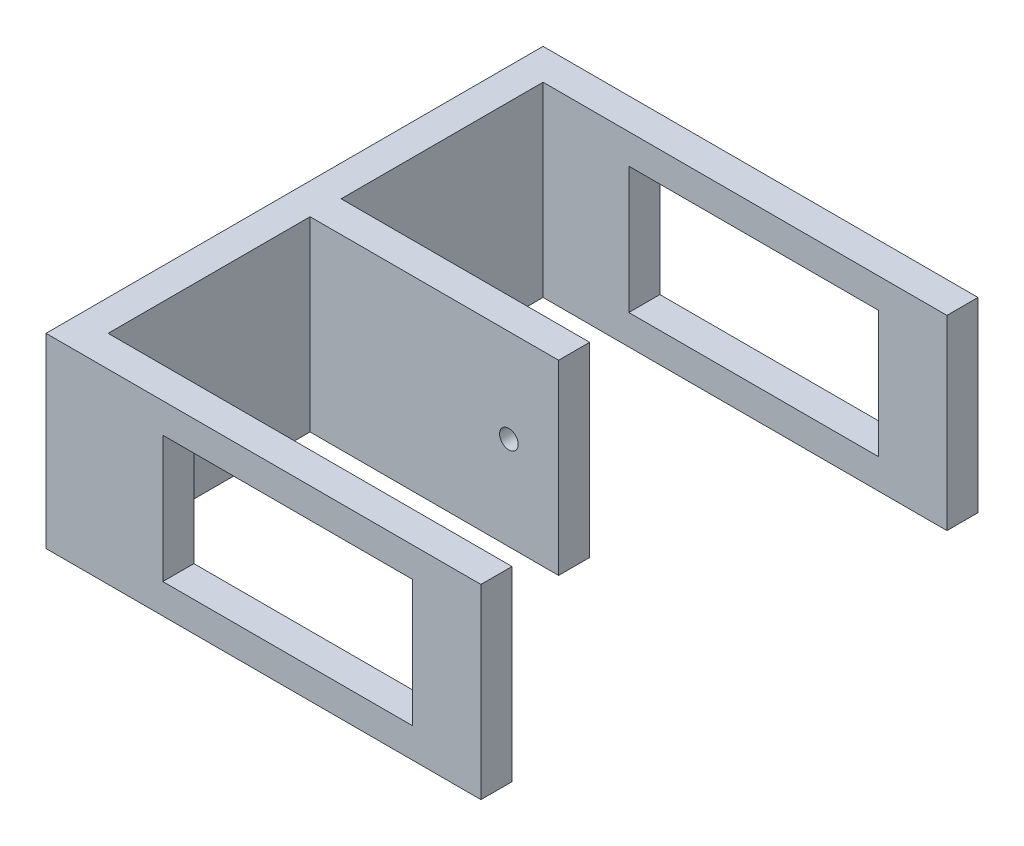
ISO-10303-21;
HEADER;
FILE_DESCRIPTION(('STEP AP214'),'2;1');
FILE_NAME('part.step','',(''),(''),'','','');
FILE_SCHEMA(('AUTOMOTIVE_DESIGN { 1 0 10303 214 1 1 1 1 }'));
ENDSEC;
DATA;
#1=APPLICATION_CONTEXT('core data for automotive mechanical design processes');
#2=APPLICATION_PROTOCOL_DEFINITION('international standard','automotive_design',2000,#1);
#3=PRODUCT_CONTEXT('',#1,'mechanical');
#4=PRODUCT('Part','Part','',(#3));
#5=PRODUCT_RELATED_PRODUCT_CATEGORY('part','',(#4));
#6=PRODUCT_DEFINITION_FORMATION('','',#4);
#7=PRODUCT_DEFINITION_CONTEXT('part definition',#1,'design');
#8=PRODUCT_DEFINITION('design','',#6,#7);
#9=PRODUCT_DEFINITION_SHAPE('','',#8);
#10=(LENGTH_UNIT() NAMED_UNIT(*) SI_UNIT(.MILLI.,.METRE.));
#11=(NAMED_UNIT(*) PLANE_ANGLE_UNIT() SI_UNIT($,.RADIAN.));
#12=(NAMED_UNIT(*) SI_UNIT($,.STERADIAN.) SOLID_ANGLE_UNIT());
#13=UNCERTAINTY_MEASURE_WITH_UNIT(LENGTH_MEASURE(1.E-05),#10,'distance_accuracy_value','');
#14=(GEOMETRIC_REPRESENTATION_CONTEXT(3) GLOBAL_UNCERTAINTY_ASSIGNED_CONTEXT((#13)) GLOBAL_UNIT_ASSIGNED_CONTEXT((#10,
#11,#12)) REPRESENTATION_CONTEXT('',''));
#15=CARTESIAN_POINT('',(0.,0.,0.));
#16=DIRECTION('',(0.,0.,1.));
#17=DIRECTION('',(1.,0.,0.));
#18=AXIS2_PLACEMENT_3D('',#15,#16,#17);
#19=CARTESIAN_POINT('',(5.,30.,80.));
#20=DIRECTION('',(-1.,0.,0.));
#21=DIRECTION('',(0.,-1.,0.));
#22=AXIS2_PLACEMENT_3D('',#19,#20,#21);
#23=PLANE('',#22);
#24=DIRECTION('',(0.,1.,0.));
#25=VECTOR('',#24,1.);
#26=CARTESIAN_POINT('',(5.,0.,37.5));
#27=LINE('',#26,#25);
#28=CARTESIAN_POINT('',(5.,0.,37.5));
#29=VERTEX_POINT('',#28);
#30=CARTESIAN_POINT('',(5.,30.,37.5));
#31=VERTEX_POINT('',#30);
#32=EDGE_CURVE('E230',#29,#31,#27,.T.);
#33=ORIENTED_EDGE('',*,*,#32,.F.);
#34=DIRECTION('',(0.,0.,-1.));
#35=VECTOR('',#34,1.);
#36=CARTESIAN_POINT('',(5.,0.,80.));
#37=LINE('',#36,#35);
#38=CARTESIAN_POINT('',(5.,0.,5.));
#39=VERTEX_POINT('',#38);
#40=EDGE_CURVE('E293',#29,#39,#37,.T.);
#41=ORIENTED_EDGE('',*,*,#40,.T.);
#42=DIRECTION('',(0.,1.,0.));
#43=VECTOR('',#42,1.);
#44=CARTESIAN_POINT('',(5.,30.,5.));
#45=LINE('',#44,#43);
#46=CARTESIAN_POINT('',(5.,30.,5.));
#47=VERTEX_POINT('',#46);
#48=EDGE_CURVE('E278',#39,#47,#45,.T.);
#49=ORIENTED_EDGE('',*,*,#48,.T.);
#50=DIRECTION('',(0.,0.,-1.));
#51=VECTOR('',#50,1.);
#52=CARTESIAN_POINT('',(5.,30.,80.));
#53=LINE('',#52,#51);
#54=EDGE_CURVE('E287',#31,#47,#53,.T.);
#55=ORIENTED_EDGE('',*,*,#54,.F.);
#56=EDGE_LOOP('',(#33,#41,#49,#55));
#57=FACE_BOUND('',#56,.T.);
#58=ADVANCED_FACE('F45',(#57),#23,.F.);
#59=DIRECTION('',(0.,-1.,0.));
#60=VECTOR('',#59,1.);
#61=CARTESIAN_POINT('',(5.,0.,42.5));
#62=LINE('',#61,#60);
#63=CARTESIAN_POINT('',(5.,30.,42.5));
#64=VERTEX_POINT('',#63);
#65=CARTESIAN_POINT('',(5.,0.,42.5));
#66=VERTEX_POINT('',#65);
#67=EDGE_CURVE('E243',#64,#66,#62,.T.);
#68=ORIENTED_EDGE('',*,*,#67,.F.);
#69=CARTESIAN_POINT('',(5.,30.,75.));
#70=VERTEX_POINT('',#69);
#71=EDGE_CURVE('E290',#70,#64,#53,.T.);
#72=ORIENTED_EDGE('',*,*,#71,.F.);
#73=DIRECTION('',(0.,1.,0.));
#74=VECTOR('',#73,1.);
#75=CARTESIAN_POINT('',(5.,30.,75.));
#76=LINE('',#75,#74);
#77=CARTESIAN_POINT('',(5.,0.,75.));
#78=VERTEX_POINT('',#77);
#79=EDGE_CURVE('E261',#78,#70,#76,.T.);
#80=ORIENTED_EDGE('',*,*,#79,.F.);
#81=EDGE_CURVE('E294',#78,#66,#37,.T.);
#82=ORIENTED_EDGE('',*,*,#81,.T.);
#83=EDGE_LOOP('',(#68,#72,#80,#82));
#84=FACE_BOUND('',#83,.T.);
#85=ADVANCED_FACE('F352',(#84),#23,.F.);
#86=CARTESIAN_POINT('',(0.,0.,5.));
#87=DIRECTION('',(0.,0.,-1.));
#88=DIRECTION('',(-1.,0.,0.));
#89=AXIS2_PLACEMENT_3D('',#86,#87,#88);
#90=PLANE('',#89);
#91=DIRECTION('',(-1.,0.,0.));
#92=VECTOR('',#91,1.);
#93=CARTESIAN_POINT('',(18.8,25.2,5.));
#94=LINE('',#93,#92);
#95=CARTESIAN_POINT('',(59.,25.2,5.));
#96=VERTEX_POINT('',#95);
#97=CARTESIAN_POINT('',(18.8,25.2,5.));
#98=VERTEX_POINT('',#97);
#99=EDGE_CURVE('E225',#96,#98,#94,.T.);
#100=ORIENTED_EDGE('',*,*,#99,.F.);
#101=DIRECTION('',(0.,1.,0.));
#102=VECTOR('',#101,1.);
#103=CARTESIAN_POINT('',(59.,4.8,5.));
#104=LINE('',#103,#102);
#105=CARTESIAN_POINT('',(59.,4.8,5.));
#106=VERTEX_POINT('',#105);
#107=EDGE_CURVE('E210',#106,#96,#104,.T.);
#108=ORIENTED_EDGE('',*,*,#107,.F.);
#109=DIRECTION('',(1.,0.,0.));
#110=VECTOR('',#109,1.);
#111=CARTESIAN_POINT('',(18.8,4.8,5.));
#112=LINE('',#111,#110);
#113=CARTESIAN_POINT('',(18.8,4.8,5.));
#114=VERTEX_POINT('',#113);
#115=EDGE_CURVE('E207',#114,#106,#112,.T.);
#116=ORIENTED_EDGE('',*,*,#115,.F.);
#117=DIRECTION('',(0.,-1.,0.));
#118=VECTOR('',#117,1.);
#119=CARTESIAN_POINT('',(18.8,4.8,5.));
#120=LINE('',#119,#118);
#121=EDGE_CURVE('E228',#98,#114,#120,.T.);
#122=ORIENTED_EDGE('',*,*,#121,.F.);
#123=EDGE_LOOP('',(#100,#108,#116,#122));
#124=FACE_BOUND('',#123,.T.);
#125=ORIENTED_EDGE('',*,*,#48,.F.);
#126=DIRECTION('',(1.,0.,0.));
#127=VECTOR('',#126,1.);
#128=CARTESIAN_POINT('',(0.,0.,5.));
#129=LINE('',#128,#127);
#130=CARTESIAN_POINT('',(70.,0.,5.));
#131=VERTEX_POINT('',#130);
#132=EDGE_CURVE('E298',#39,#131,#129,.T.);
#133=ORIENTED_EDGE('',*,*,#132,.T.);
#134=DIRECTION('',(0.,1.,0.));
#135=VECTOR('',#134,1.);
#136=CARTESIAN_POINT('',(70.,0.,5.));
#137=LINE('',#136,#135);
#138=CARTESIAN_POINT('',(70.,30.,5.));
#139=VERTEX_POINT('',#138);
#140=EDGE_CURVE('E300',#131,#139,#137,.T.);
#141=ORIENTED_EDGE('',*,*,#140,.T.);
#142=DIRECTION('',(-1.,0.,0.));
#143=VECTOR('',#142,1.);
#144=CARTESIAN_POINT('',(0.,30.,5.));
#145=LINE('',#144,#143);
#146=EDGE_CURVE('E303',#139,#47,#145,.T.);
#147=ORIENTED_EDGE('',*,*,#146,.T.);
#148=EDGE_LOOP('',(#125,#133,#141,#147));
#149=FACE_BOUND('',#148,.T.);
#150=ADVANCED_FACE('F372',(#124,#149),#90,.F.);
#151=CARTESIAN_POINT('',(0.,0.,5.));
#152=DIRECTION('',(1.,0.,0.));
#153=DIRECTION('',(0.,0.,-1.));
#154=AXIS2_PLACEMENT_3D('',#151,#152,#153);
#155=PLANE('',#154);
#156=DIRECTION('',(0.,-1.,0.));
#157=VECTOR('',#156,1.);
#158=CARTESIAN_POINT('',(0.,0.,0.));
#159=LINE('',#158,#157);
#160=CARTESIAN_POINT('',(0.,30.,0.));
#161=VERTEX_POINT('',#160);
#162=CARTESIAN_POINT('',(0.,0.,0.));
#163=VERTEX_POINT('',#162);
#164=EDGE_CURVE('E297',#161,#163,#159,.T.);
#165=ORIENTED_EDGE('',*,*,#164,.T.);
#166=DIRECTION('',(0.,0.,-1.));
#167=VECTOR('',#166,1.);
#168=CARTESIAN_POINT('',(0.,0.,5.));
#169=LINE('',#168,#167);
#170=CARTESIAN_POINT('',(0.,0.,80.));
#171=VERTEX_POINT('',#170);
#172=EDGE_CURVE('E11',#171,#163,#169,.T.);
#173=ORIENTED_EDGE('',*,*,#172,.F.);
#174=DIRECTION('',(0.,-1.,0.));
#175=VECTOR('',#174,1.);
#176=CARTESIAN_POINT('',(0.,30.,80.));
#177=LINE('',#176,#175);
#178=CARTESIAN_POINT('',(0.,30.,80.));
#179=VERTEX_POINT('',#178);
#180=EDGE_CURVE('E279',#179,#171,#177,.T.);
#181=ORIENTED_EDGE('',*,*,#180,.F.);
#182=DIRECTION('',(0.,0.,-1.));
#183=VECTOR('',#182,1.);
#184=CARTESIAN_POINT('',(0.,30.,5.));
#185=LINE('',#184,#183);
#186=EDGE_CURVE('E306',#179,#161,#185,.T.);
#187=ORIENTED_EDGE('',*,*,#186,.T.);
#188=EDGE_LOOP('',(#165,#173,#181,#187));
#189=FACE_BOUND('',#188,.T.);
#190=ADVANCED_FACE('F47',(#189),#155,.F.);
#191=CARTESIAN_POINT('',(0.,0.,5.));
#192=DIRECTION('',(0.,1.,0.));
#193=DIRECTION('',(0.,0.,1.));
#194=AXIS2_PLACEMENT_3D('',#191,#192,#193);
#195=PLANE('',#194);
#196=DIRECTION('',(1.,0.,0.));
#197=VECTOR('',#196,1.);
#198=CARTESIAN_POINT('',(0.,0.,0.));
#199=LINE('',#198,#197);
#200=CARTESIAN_POINT('',(70.,0.,0.));
#201=VERTEX_POINT('',#200);
#202=EDGE_CURVE('E309',#163,#201,#199,.T.);
#203=ORIENTED_EDGE('',*,*,#202,.T.);
#204=DIRECTION('',(0.,0.,-1.));
#205=VECTOR('',#204,1.);
#206=CARTESIAN_POINT('',(70.,0.,5.));
#207=LINE('',#206,#205);
#208=EDGE_CURVE('E53',#131,#201,#207,.T.);
#209=ORIENTED_EDGE('',*,*,#208,.F.);
#210=ORIENTED_EDGE('',*,*,#132,.F.);
#211=ORIENTED_EDGE('',*,*,#40,.F.);
#212=DIRECTION('',(-1.,0.,0.));
#213=VECTOR('',#212,1.);
#214=CARTESIAN_POINT('',(45.,0.,37.5));
#215=LINE('',#214,#213);
#216=CARTESIAN_POINT('',(45.,0.,37.5));
#217=VERTEX_POINT('',#216);
#218=EDGE_CURVE('E249',#217,#29,#215,.T.);
#219=ORIENTED_EDGE('',*,*,#218,.F.);
#220=DIRECTION('',(0.,0.,-1.));
#221=VECTOR('',#220,1.);
#222=CARTESIAN_POINT('',(45.,0.,42.5));
#223=LINE('',#222,#221);
#224=CARTESIAN_POINT('',(45.,0.,42.5));
#225=VERTEX_POINT('',#224);
#226=EDGE_CURVE('E247',#225,#217,#223,.T.);
#227=ORIENTED_EDGE('',*,*,#226,.F.);
#228=DIRECTION('',(-1.,0.,0.));
#229=VECTOR('',#228,1.);
#230=CARTESIAN_POINT('',(45.,0.,42.5));
#231=LINE('',#230,#229);
#232=EDGE_CURVE('E253',#225,#66,#231,.T.);
#233=ORIENTED_EDGE('',*,*,#232,.T.);
#234=ORIENTED_EDGE('',*,*,#81,.F.);
#235=DIRECTION('',(-1.,0.,0.));
#236=VECTOR('',#235,1.);
#237=CARTESIAN_POINT('',(70.,0.,75.));
#238=LINE('',#237,#236);
#239=CARTESIAN_POINT('',(70.,0.,75.));
#240=VERTEX_POINT('',#239);
#241=EDGE_CURVE('E276',#240,#78,#238,.T.);
#242=ORIENTED_EDGE('',*,*,#241,.F.);
#243=DIRECTION('',(0.,0.,-1.));
#244=VECTOR('',#243,1.);
#245=CARTESIAN_POINT('',(70.,0.,80.));
#246=LINE('',#245,#244);
#247=CARTESIAN_POINT('',(70.,0.,80.));
#248=VERTEX_POINT('',#247);
#249=EDGE_CURVE('E265',#248,#240,#246,.T.);
#250=ORIENTED_EDGE('',*,*,#249,.F.);
#251=DIRECTION('',(1.,0.,0.));
#252=VECTOR('',#251,1.);
#253=CARTESIAN_POINT('',(0.,0.,80.));
#254=LINE('',#253,#252);
#255=EDGE_CURVE('E282',#171,#248,#254,.T.);
#256=ORIENTED_EDGE('',*,*,#255,.F.);
#257=ORIENTED_EDGE('',*,*,#172,.T.);
#258=EDGE_LOOP('',(#203,#209,#210,#211,#219,#227,#233,#234,#242,#250,#256,#257));
#259=FACE_BOUND('',#258,.T.);
#260=ADVANCED_FACE('F359',(#259),#195,.F.);
#261=CARTESIAN_POINT('',(70.,0.,5.));
#262=DIRECTION('',(-1.,0.,0.));
#263=DIRECTION('',(0.,0.,1.));
#264=AXIS2_PLACEMENT_3D('',#261,#262,#263);
#265=PLANE('',#264);
#266=DIRECTION('',(0.,1.,0.));
#267=VECTOR('',#266,1.);
#268=CARTESIAN_POINT('',(70.,0.,0.));
#269=LINE('',#268,#267);
#270=CARTESIAN_POINT('',(70.,30.,0.));
#271=VERTEX_POINT('',#270);
#272=EDGE_CURVE('E311',#201,#271,#269,.T.);
#273=ORIENTED_EDGE('',*,*,#272,.T.);
#274=DIRECTION('',(0.,0.,-1.));
#275=VECTOR('',#274,1.);
#276=CARTESIAN_POINT('',(70.,30.,5.));
#277=LINE('',#276,#275);
#278=EDGE_CURVE('E316',#139,#271,#277,.T.);
#279=ORIENTED_EDGE('',*,*,#278,.F.);
#280=ORIENTED_EDGE('',*,*,#140,.F.);
#281=ORIENTED_EDGE('',*,*,#208,.T.);
#282=EDGE_LOOP('',(#273,#279,#280,#281));
#283=FACE_BOUND('',#282,.T.);
#284=ADVANCED_FACE('F323',(#283),#265,.F.);
#285=CARTESIAN_POINT('',(0.,30.,5.));
#286=DIRECTION('',(0.,-1.,0.));
#287=DIRECTION('',(0.,0.,-1.));
#288=AXIS2_PLACEMENT_3D('',#285,#286,#287);
#289=PLANE('',#288);
#290=DIRECTION('',(-1.,0.,0.));
#291=VECTOR('',#290,1.);
#292=CARTESIAN_POINT('',(0.,30.,0.));
#293=LINE('',#292,#291);
#294=EDGE_CURVE('E301',#271,#161,#293,.T.);
#295=ORIENTED_EDGE('',*,*,#294,.T.);
#296=ORIENTED_EDGE('',*,*,#186,.F.);
#297=DIRECTION('',(-1.,0.,0.));
#298=VECTOR('',#297,1.);
#299=CARTESIAN_POINT('',(0.,30.,80.));
#300=LINE('',#299,#298);
#301=CARTESIAN_POINT('',(70.,30.,80.));
#302=VERTEX_POINT('',#301);
#303=EDGE_CURVE('E284',#302,#179,#300,.T.);
#304=ORIENTED_EDGE('',*,*,#303,.F.);
#305=DIRECTION('',(0.,0.,1.));
#306=VECTOR('',#305,1.);
#307=CARTESIAN_POINT('',(70.,30.,80.));
#308=LINE('',#307,#306);
#309=CARTESIAN_POINT('',(70.,30.,75.));
#310=VERTEX_POINT('',#309);
#311=EDGE_CURVE('E269',#310,#302,#308,.T.);
#312=ORIENTED_EDGE('',*,*,#311,.F.);
#313=DIRECTION('',(-1.,0.,0.));
#314=VECTOR('',#313,1.);
#315=CARTESIAN_POINT('',(70.,30.,75.));
#316=LINE('',#315,#314);
#317=EDGE_CURVE('E272',#310,#70,#316,.T.);
#318=ORIENTED_EDGE('',*,*,#317,.T.);
#319=ORIENTED_EDGE('',*,*,#71,.T.);
#320=DIRECTION('',(-1.,0.,0.));
#321=VECTOR('',#320,1.);
#322=CARTESIAN_POINT('',(45.,30.,42.5));
#323=LINE('',#322,#321);
#324=CARTESIAN_POINT('',(45.,30.,42.5));
#325=VERTEX_POINT('',#324);
#326=EDGE_CURVE('E256',#325,#64,#323,.T.);
#327=ORIENTED_EDGE('',*,*,#326,.F.);
#328=DIRECTION('',(0.,0.,1.));
#329=VECTOR('',#328,1.);
#330=CARTESIAN_POINT('',(45.,30.,42.5));
#331=LINE('',#330,#329);
#332=CARTESIAN_POINT('',(45.,30.,37.5));
#333=VERTEX_POINT('',#332);
#334=EDGE_CURVE('E242',#333,#325,#331,.T.);
#335=ORIENTED_EDGE('',*,*,#334,.F.);
#336=DIRECTION('',(-1.,0.,0.));
#337=VECTOR('',#336,1.);
#338=CARTESIAN_POINT('',(45.,30.,37.5));
#339=LINE('',#338,#337);
#340=EDGE_CURVE('E258',#333,#31,#339,.T.);
#341=ORIENTED_EDGE('',*,*,#340,.T.);
#342=ORIENTED_EDGE('',*,*,#54,.T.);
#343=ORIENTED_EDGE('',*,*,#146,.F.);
#344=ORIENTED_EDGE('',*,*,#278,.T.);
#345=EDGE_LOOP('',(#295,#296,#304,#312,#318,#319,#327,#335,#341,#342,#343,#344));
#346=FACE_BOUND('',#345,.T.);
#347=ADVANCED_FACE('F332',(#346),#289,.F.);
#348=CARTESIAN_POINT('',(0.,0.,0.));
#349=DIRECTION('',(0.,0.,-1.));
#350=DIRECTION('',(-1.,0.,0.));
#351=AXIS2_PLACEMENT_3D('',#348,#349,#350);
#352=PLANE('',#351);
#353=DIRECTION('',(0.,-1.,0.));
#354=VECTOR('',#353,1.);
#355=CARTESIAN_POINT('',(59.,4.8,0.));
#356=LINE('',#355,#354);
#357=CARTESIAN_POINT('',(59.,25.2,0.));
#358=VERTEX_POINT('',#357);
#359=CARTESIAN_POINT('',(59.,4.8,0.));
#360=VERTEX_POINT('',#359);
#361=EDGE_CURVE('E220',#358,#360,#356,.T.);
#362=ORIENTED_EDGE('',*,*,#361,.F.);
#363=DIRECTION('',(1.,0.,0.));
#364=VECTOR('',#363,1.);
#365=CARTESIAN_POINT('',(18.8,25.2,0.));
#366=LINE('',#365,#364);
#367=CARTESIAN_POINT('',(18.8,25.2,0.));
#368=VERTEX_POINT('',#367);
#369=EDGE_CURVE('E211',#368,#358,#366,.T.);
#370=ORIENTED_EDGE('',*,*,#369,.F.);
#371=DIRECTION('',(0.,1.,0.));
#372=VECTOR('',#371,1.);
#373=CARTESIAN_POINT('',(18.8,4.8,0.));
#374=LINE('',#373,#372);
#375=CARTESIAN_POINT('',(18.8,4.8,0.));
#376=VERTEX_POINT('',#375);
#377=EDGE_CURVE('E214',#376,#368,#374,.T.);
#378=ORIENTED_EDGE('',*,*,#377,.F.);
#379=DIRECTION('',(-1.,0.,0.));
#380=VECTOR('',#379,1.);
#381=CARTESIAN_POINT('',(18.8,4.8,0.));
#382=LINE('',#381,#380);
#383=EDGE_CURVE('E217',#360,#376,#382,.T.);
#384=ORIENTED_EDGE('',*,*,#383,.F.);
#385=EDGE_LOOP('',(#362,#370,#378,#384));
#386=FACE_BOUND('',#385,.T.);
#387=ORIENTED_EDGE('',*,*,#164,.F.);
#388=ORIENTED_EDGE('',*,*,#294,.F.);
#389=ORIENTED_EDGE('',*,*,#272,.F.);
#390=ORIENTED_EDGE('',*,*,#202,.F.);
#391=EDGE_LOOP('',(#387,#388,#389,#390));
#392=FACE_BOUND('',#391,.T.);
#393=ADVANCED_FACE('F330',(#386,#392),#352,.T.);
#394=CARTESIAN_POINT('',(0.,0.,80.));
#395=DIRECTION('',(0.,0.,1.));
#396=DIRECTION('',(1.,0.,0.));
#397=AXIS2_PLACEMENT_3D('',#394,#395,#396);
#398=PLANE('',#397);
#399=DIRECTION('',(0.,-1.,0.));
#400=VECTOR('',#399,1.);
#401=CARTESIAN_POINT('',(18.8,4.8,80.));
#402=LINE('',#401,#400);
#403=CARTESIAN_POINT('',(18.8,25.2,80.));
#404=VERTEX_POINT('',#403);
#405=CARTESIAN_POINT('',(18.8,4.8,80.));
#406=VERTEX_POINT('',#405);
#407=EDGE_CURVE('E60',#404,#406,#402,.T.);
#408=ORIENTED_EDGE('',*,*,#407,.F.);
#409=DIRECTION('',(-1.,0.,0.));
#410=VECTOR('',#409,1.);
#411=CARTESIAN_POINT('',(59.,25.2,80.));
#412=LINE('',#411,#410);
#413=CARTESIAN_POINT('',(59.,25.2,80.));
#414=VERTEX_POINT('',#413);
#415=EDGE_CURVE('E188',#414,#404,#412,.T.);
#416=ORIENTED_EDGE('',*,*,#415,.F.);
#417=DIRECTION('',(0.,1.,0.));
#418=VECTOR('',#417,1.);
#419=CARTESIAN_POINT('',(59.,4.80000000000001,80.));
#420=LINE('',#419,#418);
#421=CARTESIAN_POINT('',(59.,4.80000000000001,80.));
#422=VERTEX_POINT('',#421);
#423=EDGE_CURVE('E451',#422,#414,#420,.T.);
#424=ORIENTED_EDGE('',*,*,#423,.F.);
#425=DIRECTION('',(1.,0.,0.));
#426=VECTOR('',#425,1.);
#427=CARTESIAN_POINT('',(59.,4.80000000000001,80.));
#428=LINE('',#427,#426);
#429=EDGE_CURVE('E454',#406,#422,#428,.T.);
#430=ORIENTED_EDGE('',*,*,#429,.F.);
#431=EDGE_LOOP('',(#408,#416,#424,#430));
#432=FACE_BOUND('',#431,.T.);
#433=ORIENTED_EDGE('',*,*,#180,.T.);
#434=ORIENTED_EDGE('',*,*,#255,.T.);
#435=DIRECTION('',(0.,-1.,0.));
#436=VECTOR('',#435,1.);
#437=CARTESIAN_POINT('',(70.,30.,80.));
#438=LINE('',#437,#436);
#439=EDGE_CURVE('E262',#302,#248,#438,.T.);
#440=ORIENTED_EDGE('',*,*,#439,.F.);
#441=ORIENTED_EDGE('',*,*,#303,.T.);
#442=EDGE_LOOP('',(#433,#434,#440,#441));
#443=FACE_BOUND('',#442,.T.);
#444=ADVANCED_FACE('F338',(#432,#443),#398,.T.);
#445=CARTESIAN_POINT('',(70.,30.,75.));
#446=DIRECTION('',(0.,0.,1.));
#447=DIRECTION('',(1.,0.,0.));
#448=AXIS2_PLACEMENT_3D('',#445,#446,#447);
#449=PLANE('',#448);
#450=DIRECTION('',(1.,0.,0.));
#451=VECTOR('',#450,1.);
#452=CARTESIAN_POINT('',(59.,25.2,75.));
#453=LINE('',#452,#451);
#454=CARTESIAN_POINT('',(18.8,25.2,75.));
#455=VERTEX_POINT('',#454);
#456=CARTESIAN_POINT('',(59.,25.2,75.));
#457=VERTEX_POINT('',#456);
#458=EDGE_CURVE('E186',#455,#457,#453,.T.);
#459=ORIENTED_EDGE('',*,*,#458,.F.);
#460=DIRECTION('',(0.,1.,0.));
#461=VECTOR('',#460,1.);
#462=CARTESIAN_POINT('',(18.8,4.8,75.));
#463=LINE('',#462,#461);
#464=CARTESIAN_POINT('',(18.8,4.8,75.));
#465=VERTEX_POINT('',#464);
#466=EDGE_CURVE('E193',#465,#455,#463,.T.);
#467=ORIENTED_EDGE('',*,*,#466,.F.);
#468=DIRECTION('',(-1.,0.,0.));
#469=VECTOR('',#468,1.);
#470=CARTESIAN_POINT('',(59.,4.80000000000001,75.));
#471=LINE('',#470,#469);
#472=CARTESIAN_POINT('',(59.,4.80000000000001,75.));
#473=VERTEX_POINT('',#472);
#474=EDGE_CURVE('E198',#473,#465,#471,.T.);
#475=ORIENTED_EDGE('',*,*,#474,.F.);
#476=DIRECTION('',(0.,-1.,0.));
#477=VECTOR('',#476,1.);
#478=CARTESIAN_POINT('',(59.,4.80000000000001,75.));
#479=LINE('',#478,#477);
#480=EDGE_CURVE('E68',#457,#473,#479,.T.);
#481=ORIENTED_EDGE('',*,*,#480,.F.);
#482=EDGE_LOOP('',(#459,#467,#475,#481));
#483=FACE_BOUND('',#482,.T.);
#484=ORIENTED_EDGE('',*,*,#79,.T.);
#485=ORIENTED_EDGE('',*,*,#317,.F.);
#486=DIRECTION('',(0.,1.,0.));
#487=VECTOR('',#486,1.);
#488=CARTESIAN_POINT('',(70.,30.,75.));
#489=LINE('',#488,#487);
#490=EDGE_CURVE('E267',#240,#310,#489,.T.);
#491=ORIENTED_EDGE('',*,*,#490,.F.);
#492=ORIENTED_EDGE('',*,*,#241,.T.);
#493=EDGE_LOOP('',(#484,#485,#491,#492));
#494=FACE_BOUND('',#493,.T.);
#495=ADVANCED_FACE('F200',(#483,#494),#449,.F.);
#496=CARTESIAN_POINT('',(70.,0.,0.));
#497=DIRECTION('',(1.,0.,0.));
#498=DIRECTION('',(0.,1.,0.));
#499=AXIS2_PLACEMENT_3D('',#496,#497,#498);
#500=PLANE('',#499);
#501=ORIENTED_EDGE('',*,*,#439,.T.);
#502=ORIENTED_EDGE('',*,*,#249,.T.);
#503=ORIENTED_EDGE('',*,*,#490,.T.);
#504=ORIENTED_EDGE('',*,*,#311,.T.);
#505=EDGE_LOOP('',(#501,#502,#503,#504));
#506=FACE_BOUND('',#505,.T.);
#507=ADVANCED_FACE('F343',(#506),#500,.T.);
#508=CARTESIAN_POINT('',(45.,0.,37.5));
#509=DIRECTION('',(0.,0.,1.));
#510=DIRECTION('',(1.,0.,0.));
#511=AXIS2_PLACEMENT_3D('',#508,#509,#510);
#512=PLANE('',#511);
#513=CARTESIAN_POINT('',(37.,15.,37.5));
#514=DIRECTION('',(0.,0.,1.));
#515=DIRECTION('',(1.,0.,0.));
#516=AXIS2_PLACEMENT_3D('',#513,#514,#515);
#517=CIRCLE('',#516,1.5);
#518=CARTESIAN_POINT('',(38.5,15.,37.5));
#519=VERTEX_POINT('',#518);
#520=EDGE_CURVE('E442',#519,#519,#517,.F.);
#521=ORIENTED_EDGE('',*,*,#520,.F.);
#522=EDGE_LOOP('',(#521));
#523=FACE_BOUND('',#522,.T.);
#524=ORIENTED_EDGE('',*,*,#32,.T.);
#525=ORIENTED_EDGE('',*,*,#340,.F.);
#526=DIRECTION('',(0.,1.,0.));
#527=VECTOR('',#526,1.);
#528=CARTESIAN_POINT('',(45.,0.,37.5));
#529=LINE('',#528,#527);
#530=EDGE_CURVE('E239',#217,#333,#529,.T.);
#531=ORIENTED_EDGE('',*,*,#530,.F.);
#532=ORIENTED_EDGE('',*,*,#218,.T.);
#533=EDGE_LOOP('',(#524,#525,#531,#532));
#534=FACE_BOUND('',#533,.T.);
#535=ADVANCED_FACE('F396',(#523,#534),#512,.F.);
#536=CARTESIAN_POINT('',(45.,0.,42.5));
#537=DIRECTION('',(0.,0.,-1.));
#538=DIRECTION('',(0.,1.,0.));
#539=AXIS2_PLACEMENT_3D('',#536,#537,#538);
#540=PLANE('',#539);
#541=CARTESIAN_POINT('',(37.,15.,42.5));
#542=DIRECTION('',(0.,0.,1.));
#543=DIRECTION('',(1.,0.,0.));
#544=AXIS2_PLACEMENT_3D('',#541,#542,#543);
#545=CIRCLE('',#544,1.5);
#546=CARTESIAN_POINT('',(38.5,15.,42.5));
#547=VERTEX_POINT('',#546);
#548=EDGE_CURVE('E439',#547,#547,#545,.T.);
#549=ORIENTED_EDGE('',*,*,#548,.F.);
#550=EDGE_LOOP('',(#549));
#551=FACE_BOUND('',#550,.T.);
#552=ORIENTED_EDGE('',*,*,#67,.T.);
#553=ORIENTED_EDGE('',*,*,#232,.F.);
#554=DIRECTION('',(0.,-1.,0.));
#555=VECTOR('',#554,1.);
#556=CARTESIAN_POINT('',(45.,0.,42.5));
#557=LINE('',#556,#555);
#558=EDGE_CURVE('E245',#325,#225,#557,.T.);
#559=ORIENTED_EDGE('',*,*,#558,.F.);
#560=ORIENTED_EDGE('',*,*,#326,.T.);
#561=EDGE_LOOP('',(#552,#553,#559,#560));
#562=FACE_BOUND('',#561,.T.);
#563=ADVANCED_FACE('F356',(#551,#562),#540,.F.);
#564=CARTESIAN_POINT('',(45.,0.,0.));
#565=DIRECTION('',(-1.,0.,0.));
#566=DIRECTION('',(0.,-1.,0.));
#567=AXIS2_PLACEMENT_3D('',#564,#565,#566);
#568=PLANE('',#567);
#569=ORIENTED_EDGE('',*,*,#530,.T.);
#570=ORIENTED_EDGE('',*,*,#334,.T.);
#571=ORIENTED_EDGE('',*,*,#558,.T.);
#572=ORIENTED_EDGE('',*,*,#226,.T.);
#573=EDGE_LOOP('',(#569,#570,#571,#572));
#574=FACE_BOUND('',#573,.T.);
#575=ADVANCED_FACE('F364',(#574),#568,.F.);
#576=CARTESIAN_POINT('',(59.,4.8,80.001));
#577=DIRECTION('',(1.,0.,0.));
#578=DIRECTION('',(0.,0.,-1.));
#579=AXIS2_PLACEMENT_3D('',#576,#577,#578);
#580=PLANE('',#579);
#581=ORIENTED_EDGE('',*,*,#107,.T.);
#582=DIRECTION('',(0.,0.,-1.));
#583=VECTOR('',#582,1.);
#584=CARTESIAN_POINT('',(59.,25.2,80.001));
#585=LINE('',#584,#583);
#586=EDGE_CURVE('E231',#96,#358,#585,.T.);
#587=ORIENTED_EDGE('',*,*,#586,.T.);
#588=ORIENTED_EDGE('',*,*,#361,.T.);
#589=DIRECTION('',(0.,0.,-1.));
#590=VECTOR('',#589,1.);
#591=CARTESIAN_POINT('',(59.,4.8,80.001));
#592=LINE('',#591,#590);
#593=EDGE_CURVE('E234',#106,#360,#592,.T.);
#594=ORIENTED_EDGE('',*,*,#593,.F.);
#595=EDGE_LOOP('',(#581,#587,#588,#594));
#596=FACE_BOUND('',#595,.T.);
#597=ADVANCED_FACE('F404',(#596),#580,.F.);
#598=CARTESIAN_POINT('',(18.8,25.2,80.001));
#599=DIRECTION('',(0.,1.,0.));
#600=DIRECTION('',(-1.,0.,0.));
#601=AXIS2_PLACEMENT_3D('',#598,#599,#600);
#602=PLANE('',#601);
#603=ORIENTED_EDGE('',*,*,#99,.T.);
#604=DIRECTION('',(0.,0.,-1.));
#605=VECTOR('',#604,1.);
#606=CARTESIAN_POINT('',(18.8,25.2,80.001));
#607=LINE('',#606,#605);
#608=EDGE_CURVE('E233',#98,#368,#607,.T.);
#609=ORIENTED_EDGE('',*,*,#608,.T.);
#610=ORIENTED_EDGE('',*,*,#369,.T.);
#611=ORIENTED_EDGE('',*,*,#586,.F.);
#612=EDGE_LOOP('',(#603,#609,#610,#611));
#613=FACE_BOUND('',#612,.T.);
#614=ADVANCED_FACE('F405',(#613),#602,.F.);
#615=CARTESIAN_POINT('',(18.8,4.8,80.001));
#616=DIRECTION('',(-1.,0.,0.));
#617=DIRECTION('',(0.,0.,1.));
#618=AXIS2_PLACEMENT_3D('',#615,#616,#617);
#619=PLANE('',#618);
#620=ORIENTED_EDGE('',*,*,#121,.T.);
#621=DIRECTION('',(0.,0.,-1.));
#622=VECTOR('',#621,1.);
#623=CARTESIAN_POINT('',(18.8,4.8,80.001));
#624=LINE('',#623,#622);
#625=EDGE_CURVE('E222',#114,#376,#624,.T.);
#626=ORIENTED_EDGE('',*,*,#625,.T.);
#627=ORIENTED_EDGE('',*,*,#377,.T.);
#628=ORIENTED_EDGE('',*,*,#608,.F.);
#629=EDGE_LOOP('',(#620,#626,#627,#628));
#630=FACE_BOUND('',#629,.T.);
#631=ADVANCED_FACE('F408',(#630),#619,.F.);
#632=CARTESIAN_POINT('',(18.8,4.8,80.001));
#633=DIRECTION('',(0.,-1.,0.));
#634=DIRECTION('',(1.,0.,0.));
#635=AXIS2_PLACEMENT_3D('',#632,#633,#634);
#636=PLANE('',#635);
#637=ORIENTED_EDGE('',*,*,#115,.T.);
#638=ORIENTED_EDGE('',*,*,#593,.T.);
#639=ORIENTED_EDGE('',*,*,#383,.T.);
#640=ORIENTED_EDGE('',*,*,#625,.F.);
#641=EDGE_LOOP('',(#637,#638,#639,#640));
#642=FACE_BOUND('',#641,.T.);
#643=ADVANCED_FACE('F412',(#642),#636,.F.);
#644=CARTESIAN_POINT('',(18.8,4.8,-0.001000000000001));
#645=DIRECTION('',(-1.,0.,0.));
#646=DIRECTION('',(0.,0.,1.));
#647=AXIS2_PLACEMENT_3D('',#644,#645,#646);
#648=PLANE('',#647);
#649=ORIENTED_EDGE('',*,*,#466,.T.);
#650=DIRECTION('',(0.,0.,1.));
#651=VECTOR('',#650,1.);
#652=CARTESIAN_POINT('',(18.8,25.2,-0.001000000000001));
#653=LINE('',#652,#651);
#654=EDGE_CURVE('E182',#455,#404,#653,.T.);
#655=ORIENTED_EDGE('',*,*,#654,.T.);
#656=ORIENTED_EDGE('',*,*,#407,.T.);
#657=DIRECTION('',(0.,0.,1.));
#658=VECTOR('',#657,1.);
#659=CARTESIAN_POINT('',(18.8,4.8,-0.001000000000001));
#660=LINE('',#659,#658);
#661=EDGE_CURVE('E190',#465,#406,#660,.T.);
#662=ORIENTED_EDGE('',*,*,#661,.F.);
#663=EDGE_LOOP('',(#649,#655,#656,#662));
#664=FACE_BOUND('',#663,.T.);
#665=ADVANCED_FACE('F194',(#664),#648,.F.);
#666=CARTESIAN_POINT('',(59.,25.2,-0.001000000000001));
#667=DIRECTION('',(0.,1.,0.));
#668=DIRECTION('',(-1.,0.,0.));
#669=AXIS2_PLACEMENT_3D('',#666,#667,#668);
#670=PLANE('',#669);
#671=ORIENTED_EDGE('',*,*,#458,.T.);
#672=DIRECTION('',(0.,0.,1.));
#673=VECTOR('',#672,1.);
#674=CARTESIAN_POINT('',(59.,25.2,-0.001000000000001));
#675=LINE('',#674,#673);
#676=EDGE_CURVE('E189',#457,#414,#675,.T.);
#677=ORIENTED_EDGE('',*,*,#676,.T.);
#678=ORIENTED_EDGE('',*,*,#415,.T.);
#679=ORIENTED_EDGE('',*,*,#654,.F.);
#680=EDGE_LOOP('',(#671,#677,#678,#679));
#681=FACE_BOUND('',#680,.T.);
#682=ADVANCED_FACE('F184',(#681),#670,.F.);
#683=CARTESIAN_POINT('',(59.,4.80000000000001,-0.001000000000001));
#684=DIRECTION('',(1.,0.,0.));
#685=DIRECTION('',(0.,0.,-1.));
#686=AXIS2_PLACEMENT_3D('',#683,#684,#685);
#687=PLANE('',#686);
#688=ORIENTED_EDGE('',*,*,#480,.T.);
#689=DIRECTION('',(0.,0.,1.));
#690=VECTOR('',#689,1.);
#691=CARTESIAN_POINT('',(59.,4.80000000000001,-0.001000000000001));
#692=LINE('',#691,#690);
#693=EDGE_CURVE('E447',#473,#422,#692,.T.);
#694=ORIENTED_EDGE('',*,*,#693,.T.);
#695=ORIENTED_EDGE('',*,*,#423,.T.);
#696=ORIENTED_EDGE('',*,*,#676,.F.);
#697=EDGE_LOOP('',(#688,#694,#695,#696));
#698=FACE_BOUND('',#697,.T.);
#699=ADVANCED_FACE('F426',(#698),#687,.F.);
#700=CARTESIAN_POINT('',(59.,4.80000000000001,-0.001000000000001));
#701=DIRECTION('',(0.,-1.,0.));
#702=DIRECTION('',(1.,0.,0.));
#703=AXIS2_PLACEMENT_3D('',#700,#701,#702);
#704=PLANE('',#703);
#705=ORIENTED_EDGE('',*,*,#474,.T.);
#706=ORIENTED_EDGE('',*,*,#661,.T.);
#707=ORIENTED_EDGE('',*,*,#429,.T.);
#708=ORIENTED_EDGE('',*,*,#693,.F.);
#709=EDGE_LOOP('',(#705,#706,#707,#708));
#710=FACE_BOUND('',#709,.T.);
#711=ADVANCED_FACE('F422',(#710),#704,.F.);
#712=CARTESIAN_POINT('',(37.,15.,-0.001000000000001));
#713=DIRECTION('',(0.,0.,1.));
#714=DIRECTION('',(1.,0.,0.));
#715=AXIS2_PLACEMENT_3D('',#712,#713,#714);
#716=CYLINDRICAL_SURFACE('',#715,1.5);
#717=ORIENTED_EDGE('',*,*,#548,.T.);
#718=EDGE_LOOP('',(#717));
#719=FACE_BOUND('',#718,.T.);
#720=ORIENTED_EDGE('',*,*,#520,.T.);
#721=EDGE_LOOP('',(#720));
#722=FACE_BOUND('',#721,.T.);
#723=ADVANCED_FACE('F425',(#719,#722),#716,.F.);
#724=CLOSED_SHELL('',(#58,#85,#150,#190,#260,#284,#347,#393,#444,#495,#507,#535,#563,#575,#597,
#614,#631,#643,#665,#682,#699,#711,#723));
#725=MANIFOLD_SOLID_BREP('B2',#724);
#726=ADVANCED_BREP_SHAPE_REPRESENTATION('',(#18,#725),#14);
#727=SHAPE_DEFINITION_REPRESENTATION(#9,#726);
ENDSEC;
END-ISO-10303-21;
